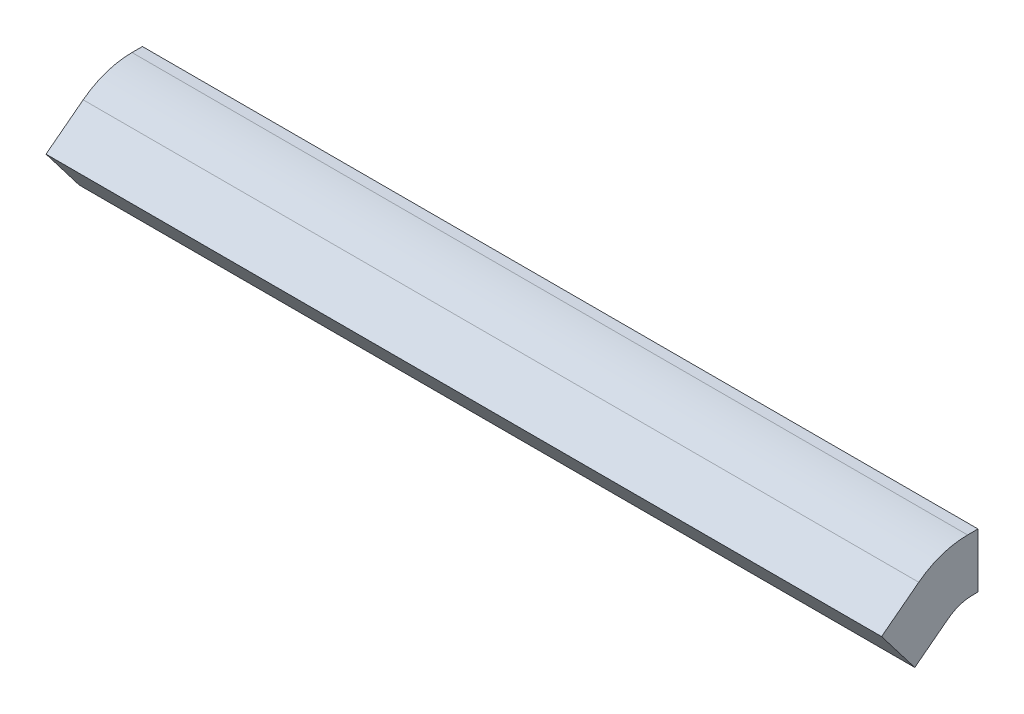
ISO-10303-21;
HEADER;
FILE_DESCRIPTION(('STEP AP214'),'2;1');
FILE_NAME('part.step','',(''),(''),'','','');
FILE_SCHEMA(('AUTOMOTIVE_DESIGN { 1 0 10303 214 1 1 1 1 }'));
ENDSEC;
DATA;
#1=APPLICATION_CONTEXT('core data for automotive mechanical design processes');
#2=APPLICATION_PROTOCOL_DEFINITION('international standard','automotive_design',2000,#1);
#3=PRODUCT_CONTEXT('',#1,'mechanical');
#4=PRODUCT('Part','Part','',(#3));
#5=PRODUCT_RELATED_PRODUCT_CATEGORY('part','',(#4));
#6=PRODUCT_DEFINITION_FORMATION('','',#4);
#7=PRODUCT_DEFINITION_CONTEXT('part definition',#1,'design');
#8=PRODUCT_DEFINITION('design','',#6,#7);
#9=PRODUCT_DEFINITION_SHAPE('','',#8);
#10=(LENGTH_UNIT() NAMED_UNIT(*) SI_UNIT(.MILLI.,.METRE.));
#11=(NAMED_UNIT(*) PLANE_ANGLE_UNIT() SI_UNIT($,.RADIAN.));
#12=(NAMED_UNIT(*) SI_UNIT($,.STERADIAN.) SOLID_ANGLE_UNIT());
#13=UNCERTAINTY_MEASURE_WITH_UNIT(LENGTH_MEASURE(1.E-05),#10,'distance_accuracy_value','');
#14=(GEOMETRIC_REPRESENTATION_CONTEXT(3) GLOBAL_UNCERTAINTY_ASSIGNED_CONTEXT((#13)) GLOBAL_UNIT_ASSIGNED_CONTEXT((#10,
#11,#12)) REPRESENTATION_CONTEXT('',''));
#15=CARTESIAN_POINT('',(0.,0.,0.));
#16=DIRECTION('',(0.,0.,1.));
#17=DIRECTION('',(1.,0.,0.));
#18=AXIS2_PLACEMENT_3D('',#15,#16,#17);
#19=CARTESIAN_POINT('',(3.2,-1.2,3.1));
#20=DIRECTION('',(0.,0.607764068228583,-0.794117647058824));
#21=DIRECTION('',(0.,0.794117647058824,0.607764068228583));
#22=AXIS2_PLACEMENT_3D('',#19,#20,#21);
#23=PLANE('',#22);
#24=DIRECTION('',(1.,0.,0.));
#25=VECTOR('',#24,1.);
#26=CARTESIAN_POINT('',(3.2,-1.47,2.89336021680228));
#27=LINE('',#26,#25);
#28=CARTESIAN_POINT('',(-2.6,-1.47,2.89336021680228));
#29=VERTEX_POINT('',#28);
#30=CARTESIAN_POINT('',(2.6,-1.47,2.89336021680228));
#31=VERTEX_POINT('',#30);
#32=EDGE_CURVE('E112',#29,#31,#27,.T.);
#33=ORIENTED_EDGE('',*,*,#32,.T.);
#34=DIRECTION('',(0.,0.794117647058824,0.607764068228583));
#35=VECTOR('',#34,1.);
#36=CARTESIAN_POINT('',(2.6,-1.2,3.1));
#37=LINE('',#36,#35);
#38=CARTESIAN_POINT('',(2.6,-1.2,3.1));
#39=VERTEX_POINT('',#38);
#40=EDGE_CURVE('E86',#39,#31,#37,.F.);
#41=ORIENTED_EDGE('',*,*,#40,.F.);
#42=DIRECTION('',(1.,0.,0.));
#43=VECTOR('',#42,1.);
#44=CARTESIAN_POINT('',(3.2,-1.2,3.1));
#45=LINE('',#44,#43);
#46=CARTESIAN_POINT('',(-2.6,-1.2,3.1));
#47=VERTEX_POINT('',#46);
#48=EDGE_CURVE('E106',#39,#47,#45,.F.);
#49=ORIENTED_EDGE('',*,*,#48,.T.);
#50=DIRECTION('',(0.,0.794117647058824,0.607764068228583));
#51=VECTOR('',#50,1.);
#52=CARTESIAN_POINT('',(-2.6,-1.2,3.1));
#53=LINE('',#52,#51);
#54=EDGE_CURVE('E122',#29,#47,#53,.T.);
#55=ORIENTED_EDGE('',*,*,#54,.F.);
#56=EDGE_LOOP('',(#33,#41,#49,#55));
#57=FACE_BOUND('',#56,.T.);
#58=ADVANCED_FACE('F17',(#57),#23,.F.);
#59=CARTESIAN_POINT('',(3.2,-1.47,2.89336021680228));
#60=DIRECTION('',(0.,0.794117647058824,0.607764068228583));
#61=DIRECTION('',(0.,-0.607764068228583,0.794117647058824));
#62=AXIS2_PLACEMENT_3D('',#59,#60,#61);
#63=PLANE('',#62);
#64=ORIENTED_EDGE('',*,*,#32,.F.);
#65=DIRECTION('',(0.,-0.607764068228583,0.794117647058824));
#66=VECTOR('',#65,1.);
#67=CARTESIAN_POINT('',(-2.6,-1.47,2.89336021680228));
#68=LINE('',#67,#66);
#69=CARTESIAN_POINT('',(-2.6,-1.3114705882353,2.68622226633553));
#70=VERTEX_POINT('',#69);
#71=EDGE_CURVE('E89',#70,#29,#68,.T.);
#72=ORIENTED_EDGE('',*,*,#71,.F.);
#73=DIRECTION('',(-1.,0.,0.));
#74=VECTOR('',#73,1.);
#75=CARTESIAN_POINT('',(3.2,-1.31147058823529,2.68622226633553));
#76=LINE('',#75,#74);
#77=CARTESIAN_POINT('',(2.6,-1.3114705882353,2.68622226633553));
#78=VERTEX_POINT('',#77);
#79=EDGE_CURVE('E94',#70,#78,#76,.F.);
#80=ORIENTED_EDGE('',*,*,#79,.T.);
#81=DIRECTION('',(0.,-0.607764068228583,0.794117647058824));
#82=VECTOR('',#81,1.);
#83=CARTESIAN_POINT('',(2.6,-1.47,2.89336021680228));
#84=LINE('',#83,#82);
#85=EDGE_CURVE('E79',#31,#78,#84,.F.);
#86=ORIENTED_EDGE('',*,*,#85,.F.);
#87=EDGE_LOOP('',(#64,#72,#80,#86));
#88=FACE_BOUND('',#87,.T.);
#89=ADVANCED_FACE('F101',(#88),#63,.F.);
#90=CARTESIAN_POINT('',(3.2,-1.02294117647059,2.86865112025791));
#91=DIRECTION('',(0.,-0.794117647058824,-0.607764068228582));
#92=DIRECTION('',(0.,0.607764068228582,-0.794117647058824));
#93=AXIS2_PLACEMENT_3D('',#90,#91,#92);
#94=PLANE('',#93);
#95=ORIENTED_EDGE('',*,*,#48,.F.);
#96=DIRECTION('',(0.,0.607764068228582,-0.794117647058824));
#97=VECTOR('',#96,1.);
#98=CARTESIAN_POINT('',(2.6,-1.02294117647059,2.86865112025791));
#99=LINE('',#98,#97);
#100=CARTESIAN_POINT('',(2.6,-1.02294117647059,2.86865112025791));
#101=VERTEX_POINT('',#100);
#102=EDGE_CURVE('E119',#101,#39,#99,.F.);
#103=ORIENTED_EDGE('',*,*,#102,.F.);
#104=DIRECTION('',(-1.,0.,0.));
#105=VECTOR('',#104,1.);
#106=CARTESIAN_POINT('',(3.2,-1.02294117647059,2.86865112025791));
#107=LINE('',#106,#105);
#108=CARTESIAN_POINT('',(-2.6,-1.02294117647059,2.86865112025791));
#109=VERTEX_POINT('',#108);
#110=EDGE_CURVE('E135',#109,#101,#107,.F.);
#111=ORIENTED_EDGE('',*,*,#110,.F.);
#112=DIRECTION('',(0.,0.607764068228582,-0.794117647058824));
#113=VECTOR('',#112,1.);
#114=CARTESIAN_POINT('',(-2.6,-1.02294117647059,2.86865112025791));
#115=LINE('',#114,#113);
#116=EDGE_CURVE('E103',#47,#109,#115,.T.);
#117=ORIENTED_EDGE('',*,*,#116,.F.);
#118=EDGE_LOOP('',(#95,#103,#111,#117));
#119=FACE_BOUND('',#118,.T.);
#120=ADVANCED_FACE('F195',(#119),#94,.F.);
#121=CARTESIAN_POINT('',(3.2,-1.51,2.53428124927838));
#122=DIRECTION('',(-1.,0.,0.));
#123=DIRECTION('',(0.,0.,1.));
#124=AXIS2_PLACEMENT_3D('',#121,#122,#123);
#125=CYLINDRICAL_SURFACE('',#124,0.25);
#126=DIRECTION('',(1.,0.,0.));
#127=VECTOR('',#126,1.);
#128=CARTESIAN_POINT('',(3.2,-1.26,2.53428124927838));
#129=LINE('',#128,#127);
#130=CARTESIAN_POINT('',(-2.6,-1.26,2.53428124927838));
#131=VERTEX_POINT('',#130);
#132=CARTESIAN_POINT('',(2.6,-1.26,2.53428124927838));
#133=VERTEX_POINT('',#132);
#134=EDGE_CURVE('E97',#131,#133,#129,.T.);
#135=ORIENTED_EDGE('',*,*,#134,.T.);
#136=CARTESIAN_POINT('',(2.6,-1.51,2.53428124927838));
#137=DIRECTION('',(-1.,0.,0.));
#138=DIRECTION('',(0.,0.,1.));
#139=AXIS2_PLACEMENT_3D('',#136,#137,#138);
#140=CIRCLE('',#139,0.25);
#141=EDGE_CURVE('E83',#78,#133,#140,.T.);
#142=ORIENTED_EDGE('',*,*,#141,.F.);
#143=ORIENTED_EDGE('',*,*,#79,.F.);
#144=CARTESIAN_POINT('',(-2.6,-1.51,2.53428124927838));
#145=DIRECTION('',(-1.,0.,0.));
#146=DIRECTION('',(0.,0.,1.));
#147=AXIS2_PLACEMENT_3D('',#144,#145,#146);
#148=CIRCLE('',#147,0.25);
#149=EDGE_CURVE('E99',#131,#70,#148,.F.);
#150=ORIENTED_EDGE('',*,*,#149,.F.);
#151=EDGE_LOOP('',(#135,#142,#143,#150));
#152=FACE_BOUND('',#151,.T.);
#153=ADVANCED_FACE('F93',(#152),#125,.F.);
#154=CARTESIAN_POINT('',(3.2,-1.42,2.56476908614361));
#155=DIRECTION('',(-1.,0.,0.));
#156=DIRECTION('',(0.,0.,1.));
#157=AXIS2_PLACEMENT_3D('',#154,#155,#156);
#158=CYLINDRICAL_SURFACE('',#157,0.5);
#159=CARTESIAN_POINT('',(2.6,-1.42,2.56476908614361));
#160=DIRECTION('',(-1.,0.,0.));
#161=DIRECTION('',(0.,0.,1.));
#162=AXIS2_PLACEMENT_3D('',#159,#160,#161);
#163=CIRCLE('',#162,0.5);
#164=CARTESIAN_POINT('',(2.6,-0.92,2.56476908614361));
#165=VERTEX_POINT('',#164);
#166=EDGE_CURVE('E129',#101,#165,#163,.T.);
#167=ORIENTED_EDGE('',*,*,#166,.T.);
#168=DIRECTION('',(1.,0.,0.));
#169=VECTOR('',#168,1.);
#170=CARTESIAN_POINT('',(3.2,-0.92,2.56476908614361));
#171=LINE('',#170,#169);
#172=CARTESIAN_POINT('',(-2.6,-0.92,2.56476908614361));
#173=VERTEX_POINT('',#172);
#174=EDGE_CURVE('E154',#165,#173,#171,.F.);
#175=ORIENTED_EDGE('',*,*,#174,.T.);
#176=CARTESIAN_POINT('',(-2.6,-1.42,2.56476908614361));
#177=DIRECTION('',(-1.,0.,0.));
#178=DIRECTION('',(0.,0.,1.));
#179=AXIS2_PLACEMENT_3D('',#176,#177,#178);
#180=CIRCLE('',#179,0.5);
#181=EDGE_CURVE('E133',#173,#109,#180,.F.);
#182=ORIENTED_EDGE('',*,*,#181,.T.);
#183=ORIENTED_EDGE('',*,*,#110,.T.);
#184=EDGE_LOOP('',(#167,#175,#182,#183));
#185=FACE_BOUND('',#184,.T.);
#186=ADVANCED_FACE('F190',(#185),#158,.T.);
#187=CARTESIAN_POINT('',(3.2,-1.26,2.53428124927838));
#188=DIRECTION('',(0.,1.,0.));
#189=DIRECTION('',(0.,0.,1.));
#190=AXIS2_PLACEMENT_3D('',#187,#188,#189);
#191=PLANE('',#190);
#192=DIRECTION('',(1.,0.,0.));
#193=VECTOR('',#192,1.);
#194=CARTESIAN_POINT('',(3.2,-1.26,2.5));
#195=LINE('',#194,#193);
#196=CARTESIAN_POINT('',(-2.6,-1.26,2.5));
#197=VERTEX_POINT('',#196);
#198=CARTESIAN_POINT('',(2.6,-1.26,2.5));
#199=VERTEX_POINT('',#198);
#200=EDGE_CURVE('E150',#197,#199,#195,.T.);
#201=ORIENTED_EDGE('',*,*,#200,.T.);
#202=DIRECTION('',(0.,0.,1.));
#203=VECTOR('',#202,1.);
#204=CARTESIAN_POINT('',(2.6,-1.26,2.56476908614361));
#205=LINE('',#204,#203);
#206=EDGE_CURVE('E132',#199,#133,#205,.T.);
#207=ORIENTED_EDGE('',*,*,#206,.T.);
#208=ORIENTED_EDGE('',*,*,#134,.F.);
#209=DIRECTION('',(0.,0.,1.));
#210=VECTOR('',#209,1.);
#211=CARTESIAN_POINT('',(-2.6,-1.26,2.56476908614361));
#212=LINE('',#211,#210);
#213=EDGE_CURVE('E168',#197,#131,#212,.T.);
#214=ORIENTED_EDGE('',*,*,#213,.F.);
#215=EDGE_LOOP('',(#201,#207,#208,#214));
#216=FACE_BOUND('',#215,.T.);
#217=ADVANCED_FACE('F181',(#216),#191,.F.);
#218=CARTESIAN_POINT('',(2.6,-1.42,2.56476908614361));
#219=DIRECTION('',(-1.,0.,0.));
#220=DIRECTION('',(0.,0.,1.));
#221=AXIS2_PLACEMENT_3D('',#218,#219,#220);
#222=PLANE('',#221);
#223=DIRECTION('',(0.,0.,-1.));
#224=VECTOR('',#223,1.);
#225=CARTESIAN_POINT('',(2.6,-0.92,2.5));
#226=LINE('',#225,#224);
#227=CARTESIAN_POINT('',(2.6,-0.92,2.5));
#228=VERTEX_POINT('',#227);
#229=EDGE_CURVE('E131',#228,#165,#226,.F.);
#230=ORIENTED_EDGE('',*,*,#229,.T.);
#231=ORIENTED_EDGE('',*,*,#166,.F.);
#232=ORIENTED_EDGE('',*,*,#102,.T.);
#233=ORIENTED_EDGE('',*,*,#40,.T.);
#234=ORIENTED_EDGE('',*,*,#85,.T.);
#235=ORIENTED_EDGE('',*,*,#141,.T.);
#236=ORIENTED_EDGE('',*,*,#206,.F.);
#237=DIRECTION('',(0.,1.,0.));
#238=VECTOR('',#237,1.);
#239=CARTESIAN_POINT('',(2.6,-1.26,2.5));
#240=LINE('',#239,#238);
#241=EDGE_CURVE('E147',#199,#228,#240,.T.);
#242=ORIENTED_EDGE('',*,*,#241,.T.);
#243=EDGE_LOOP('',(#230,#231,#232,#233,#234,#235,#236,#242));
#244=FACE_BOUND('',#243,.T.);
#245=ADVANCED_FACE('F82',(#244),#222,.F.);
#246=CARTESIAN_POINT('',(3.2,-0.92,2.5));
#247=DIRECTION('',(0.,-1.,0.));
#248=DIRECTION('',(0.,0.,-1.));
#249=AXIS2_PLACEMENT_3D('',#246,#247,#248);
#250=PLANE('',#249);
#251=ORIENTED_EDGE('',*,*,#174,.F.);
#252=ORIENTED_EDGE('',*,*,#229,.F.);
#253=DIRECTION('',(1.,0.,0.));
#254=VECTOR('',#253,1.);
#255=CARTESIAN_POINT('',(3.2,-0.92,2.5));
#256=LINE('',#255,#254);
#257=CARTESIAN_POINT('',(-2.6,-0.92,2.5));
#258=VERTEX_POINT('',#257);
#259=EDGE_CURVE('E26',#228,#258,#256,.F.);
#260=ORIENTED_EDGE('',*,*,#259,.T.);
#261=DIRECTION('',(0.,0.,1.));
#262=VECTOR('',#261,1.);
#263=CARTESIAN_POINT('',(-2.6,-0.92,2.56476908614361));
#264=LINE('',#263,#262);
#265=EDGE_CURVE('E34',#173,#258,#264,.F.);
#266=ORIENTED_EDGE('',*,*,#265,.F.);
#267=EDGE_LOOP('',(#251,#252,#260,#266));
#268=FACE_BOUND('',#267,.T.);
#269=ADVANCED_FACE('F188',(#268),#250,.F.);
#270=CARTESIAN_POINT('',(-2.6,-1.42,2.56476908614361));
#271=DIRECTION('',(-1.,0.,0.));
#272=DIRECTION('',(0.,0.,1.));
#273=AXIS2_PLACEMENT_3D('',#270,#271,#272);
#274=PLANE('',#273);
#275=ORIENTED_EDGE('',*,*,#181,.F.);
#276=ORIENTED_EDGE('',*,*,#265,.T.);
#277=DIRECTION('',(0.,1.,0.));
#278=VECTOR('',#277,1.);
#279=CARTESIAN_POINT('',(-2.6,-1.26,2.5));
#280=LINE('',#279,#278);
#281=EDGE_CURVE('E11',#258,#197,#280,.F.);
#282=ORIENTED_EDGE('',*,*,#281,.T.);
#283=ORIENTED_EDGE('',*,*,#213,.T.);
#284=ORIENTED_EDGE('',*,*,#149,.T.);
#285=ORIENTED_EDGE('',*,*,#71,.T.);
#286=ORIENTED_EDGE('',*,*,#54,.T.);
#287=ORIENTED_EDGE('',*,*,#116,.T.);
#288=EDGE_LOOP('',(#275,#276,#282,#283,#284,#285,#286,#287));
#289=FACE_BOUND('',#288,.T.);
#290=ADVANCED_FACE('F179',(#289),#274,.T.);
#291=CARTESIAN_POINT('',(3.2,-1.26,2.5));
#292=DIRECTION('',(0.,0.,1.));
#293=DIRECTION('',(1.,0.,0.));
#294=AXIS2_PLACEMENT_3D('',#291,#292,#293);
#295=PLANE('',#294);
#296=ORIENTED_EDGE('',*,*,#259,.F.);
#297=ORIENTED_EDGE('',*,*,#241,.F.);
#298=ORIENTED_EDGE('',*,*,#200,.F.);
#299=ORIENTED_EDGE('',*,*,#281,.F.);
#300=EDGE_LOOP('',(#296,#297,#298,#299));
#301=FACE_BOUND('',#300,.T.);
#302=ADVANCED_FACE('F185',(#301),#295,.F.);
#303=CLOSED_SHELL('',(#58,#89,#120,#153,#186,#217,#245,#269,#290,#302));
#304=MANIFOLD_SOLID_BREP('B1',#303);
#305=ADVANCED_BREP_SHAPE_REPRESENTATION('',(#18,#304),#14);
#306=SHAPE_DEFINITION_REPRESENTATION(#9,#305);
ENDSEC;
END-ISO-10303-21;
